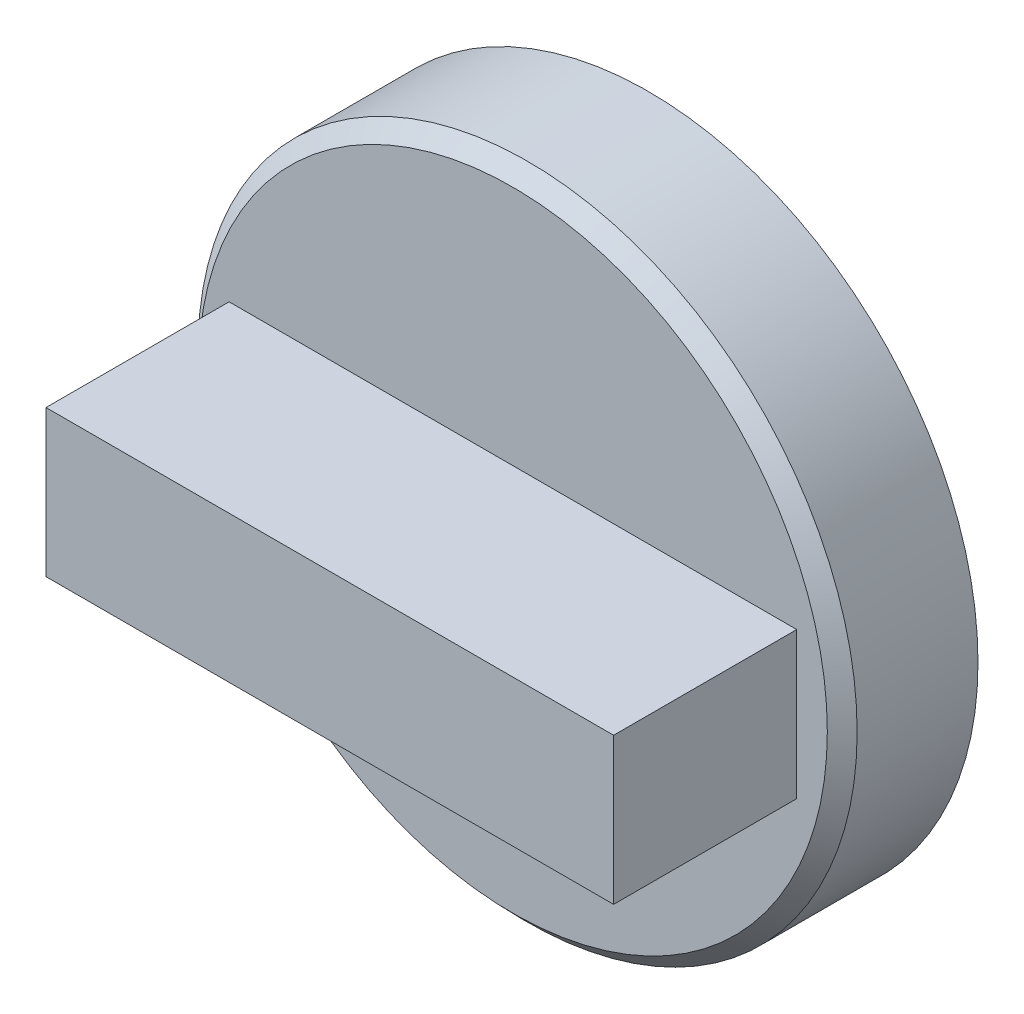
ISO-10303-21;
HEADER;
FILE_DESCRIPTION(('STEP AP214'),'2;1');
FILE_NAME('part.step','',(''),(''),'','','');
FILE_SCHEMA(('AUTOMOTIVE_DESIGN { 1 0 10303 214 1 1 1 1 }'));
ENDSEC;
DATA;
#1=APPLICATION_CONTEXT('core data for automotive mechanical design processes');
#2=APPLICATION_PROTOCOL_DEFINITION('international standard','automotive_design',2000,#1);
#3=PRODUCT_CONTEXT('',#1,'mechanical');
#4=PRODUCT('Part','Part','',(#3));
#5=PRODUCT_RELATED_PRODUCT_CATEGORY('part','',(#4));
#6=PRODUCT_DEFINITION_FORMATION('','',#4);
#7=PRODUCT_DEFINITION_CONTEXT('part definition',#1,'design');
#8=PRODUCT_DEFINITION('design','',#6,#7);
#9=PRODUCT_DEFINITION_SHAPE('','',#8);
#10=(LENGTH_UNIT() NAMED_UNIT(*) SI_UNIT(.MILLI.,.METRE.));
#11=(NAMED_UNIT(*) PLANE_ANGLE_UNIT() SI_UNIT($,.RADIAN.));
#12=(NAMED_UNIT(*) SI_UNIT($,.STERADIAN.) SOLID_ANGLE_UNIT());
#13=UNCERTAINTY_MEASURE_WITH_UNIT(LENGTH_MEASURE(1.E-05),#10,'distance_accuracy_value','');
#14=(GEOMETRIC_REPRESENTATION_CONTEXT(3) GLOBAL_UNCERTAINTY_ASSIGNED_CONTEXT((#13)) GLOBAL_UNIT_ASSIGNED_CONTEXT((#10,
#11,#12)) REPRESENTATION_CONTEXT('',''));
#15=CARTESIAN_POINT('',(0.,0.,0.));
#16=DIRECTION('',(0.,0.,1.));
#17=DIRECTION('',(1.,0.,0.));
#18=AXIS2_PLACEMENT_3D('',#15,#16,#17);
#19=CARTESIAN_POINT('',(0.,0.,37.));
#20=DIRECTION('',(0.,0.,-1.));
#21=DIRECTION('',(-1.,0.,0.));
#22=AXIS2_PLACEMENT_3D('',#19,#20,#21);
#23=CYLINDRICAL_SURFACE('',#22,90.);
#24=CARTESIAN_POINT('',(0.,0.,33.));
#25=DIRECTION('',(0.,0.,1.));
#26=DIRECTION('',(1.,0.,0.));
#27=AXIS2_PLACEMENT_3D('',#24,#25,#26);
#28=CIRCLE('',#27,90.);
#29=CARTESIAN_POINT('',(90.,0.,33.));
#30=VERTEX_POINT('',#29);
#31=EDGE_CURVE('E11',#30,#30,#28,.F.);
#32=ORIENTED_EDGE('',*,*,#31,.T.);
#33=EDGE_LOOP('',(#32));
#34=FACE_BOUND('',#33,.T.);
#35=CARTESIAN_POINT('',(0.,0.,0.));
#36=DIRECTION('',(0.,0.,1.));
#37=DIRECTION('',(1.,0.,0.));
#38=AXIS2_PLACEMENT_3D('',#35,#36,#37);
#39=CIRCLE('',#38,90.);
#40=CARTESIAN_POINT('',(90.,0.,0.));
#41=VERTEX_POINT('',#40);
#42=EDGE_CURVE('E94',#41,#41,#39,.T.);
#43=ORIENTED_EDGE('',*,*,#42,.T.);
#44=EDGE_LOOP('',(#43));
#45=FACE_BOUND('',#44,.T.);
#46=ADVANCED_FACE('F33',(#34,#45),#23,.T.);
#47=CARTESIAN_POINT('',(0.,0.,37.));
#48=DIRECTION('',(0.,0.,1.));
#49=DIRECTION('',(1.,0.,0.));
#50=AXIS2_PLACEMENT_3D('',#47,#48,#49);
#51=PLANE('',#50);
#52=DIRECTION('',(0.,1.,0.));
#53=VECTOR('',#52,1.);
#54=CARTESIAN_POINT('',(77.5,20.,37.));
#55=LINE('',#54,#53);
#56=CARTESIAN_POINT('',(77.5,-20.,37.));
#57=VERTEX_POINT('',#56);
#58=CARTESIAN_POINT('',(77.5,20.,37.));
#59=VERTEX_POINT('',#58);
#60=EDGE_CURVE('E48',#57,#59,#55,.T.);
#61=ORIENTED_EDGE('',*,*,#60,.F.);
#62=DIRECTION('',(1.,0.,0.));
#63=VECTOR('',#62,1.);
#64=CARTESIAN_POINT('',(-77.5,-20.,37.));
#65=LINE('',#64,#63);
#66=CARTESIAN_POINT('',(-77.5,-20.,37.));
#67=VERTEX_POINT('',#66);
#68=EDGE_CURVE('E52',#67,#57,#65,.T.);
#69=ORIENTED_EDGE('',*,*,#68,.F.);
#70=DIRECTION('',(0.,-1.,0.));
#71=VECTOR('',#70,1.);
#72=CARTESIAN_POINT('',(-77.5,20.,37.));
#73=LINE('',#72,#71);
#74=CARTESIAN_POINT('',(-77.5,20.,37.));
#75=VERTEX_POINT('',#74);
#76=EDGE_CURVE('E189',#75,#67,#73,.T.);
#77=ORIENTED_EDGE('',*,*,#76,.F.);
#78=DIRECTION('',(-1.,0.,0.));
#79=VECTOR('',#78,1.);
#80=CARTESIAN_POINT('',(-77.5,20.,37.));
#81=LINE('',#80,#79);
#82=EDGE_CURVE('E195',#59,#75,#81,.T.);
#83=ORIENTED_EDGE('',*,*,#82,.F.);
#84=EDGE_LOOP('',(#61,#69,#77,#83));
#85=FACE_BOUND('',#84,.T.);
#86=CARTESIAN_POINT('',(0.,0.,37.));
#87=DIRECTION('',(0.,0.,1.));
#88=DIRECTION('',(1.,0.,0.));
#89=AXIS2_PLACEMENT_3D('',#86,#87,#88);
#90=CIRCLE('',#89,85.8578787448378);
#91=CARTESIAN_POINT('',(85.8578787448378,0.,37.));
#92=VERTEX_POINT('',#91);
#93=EDGE_CURVE('E41',#92,#92,#90,.T.);
#94=ORIENTED_EDGE('',*,*,#93,.T.);
#95=EDGE_LOOP('',(#94));
#96=FACE_BOUND('',#95,.T.);
#97=ADVANCED_FACE('F104',(#85,#96),#51,.T.);
#98=CARTESIAN_POINT('',(0.,0.,0.));
#99=DIRECTION('',(0.,0.,1.));
#100=DIRECTION('',(1.,0.,0.));
#101=AXIS2_PLACEMENT_3D('',#98,#99,#100);
#102=PLANE('',#101);
#103=ORIENTED_EDGE('',*,*,#42,.F.);
#104=EDGE_LOOP('',(#103));
#105=FACE_BOUND('',#104,.T.);
#106=ADVANCED_FACE('F107',(#105),#102,.F.);
#107=CARTESIAN_POINT('',(0.,0.,37.));
#108=DIRECTION('',(0.,0.,-1.));
#109=DIRECTION('',(-1.,0.,0.));
#110=AXIS2_PLACEMENT_3D('',#107,#108,#109);
#111=CONICAL_SURFACE('',#110,85.8578787448378,0.802851455917391);
#112=ORIENTED_EDGE('',*,*,#31,.F.);
#113=EDGE_LOOP('',(#112));
#114=FACE_BOUND('',#113,.T.);
#115=ORIENTED_EDGE('',*,*,#93,.F.);
#116=EDGE_LOOP('',(#115));
#117=FACE_BOUND('',#116,.T.);
#118=ADVANCED_FACE('F35',(#114,#117),#111,.T.);
#119=CARTESIAN_POINT('',(77.5,20.,87.));
#120=DIRECTION('',(-1.,0.,0.));
#121=DIRECTION('',(0.,0.,1.));
#122=AXIS2_PLACEMENT_3D('',#119,#120,#121);
#123=PLANE('',#122);
#124=ORIENTED_EDGE('',*,*,#60,.T.);
#125=DIRECTION('',(0.,0.,-1.));
#126=VECTOR('',#125,1.);
#127=CARTESIAN_POINT('',(77.5,20.,87.));
#128=LINE('',#127,#126);
#129=CARTESIAN_POINT('',(77.5,20.,87.));
#130=VERTEX_POINT('',#129);
#131=EDGE_CURVE('E77',#130,#59,#128,.T.);
#132=ORIENTED_EDGE('',*,*,#131,.F.);
#133=DIRECTION('',(0.,1.,0.));
#134=VECTOR('',#133,1.);
#135=CARTESIAN_POINT('',(77.5,20.,87.));
#136=LINE('',#135,#134);
#137=CARTESIAN_POINT('',(77.5,-20.,87.));
#138=VERTEX_POINT('',#137);
#139=EDGE_CURVE('E83',#138,#130,#136,.T.);
#140=ORIENTED_EDGE('',*,*,#139,.F.);
#141=DIRECTION('',(0.,0.,-1.));
#142=VECTOR('',#141,1.);
#143=CARTESIAN_POINT('',(77.5,-20.,87.));
#144=LINE('',#143,#142);
#145=EDGE_CURVE('E187',#138,#57,#144,.T.);
#146=ORIENTED_EDGE('',*,*,#145,.T.);
#147=EDGE_LOOP('',(#124,#132,#140,#146));
#148=FACE_BOUND('',#147,.T.);
#149=ADVANCED_FACE('F93',(#148),#123,.F.);
#150=CARTESIAN_POINT('',(-77.5,20.,87.));
#151=DIRECTION('',(0.,-1.,0.));
#152=DIRECTION('',(0.,0.,-1.));
#153=AXIS2_PLACEMENT_3D('',#150,#151,#152);
#154=PLANE('',#153);
#155=ORIENTED_EDGE('',*,*,#82,.T.);
#156=DIRECTION('',(0.,0.,-1.));
#157=VECTOR('',#156,1.);
#158=CARTESIAN_POINT('',(-77.5,20.,87.));
#159=LINE('',#158,#157);
#160=CARTESIAN_POINT('',(-77.5,20.,87.));
#161=VERTEX_POINT('',#160);
#162=EDGE_CURVE('E79',#161,#75,#159,.T.);
#163=ORIENTED_EDGE('',*,*,#162,.F.);
#164=DIRECTION('',(-1.,0.,0.));
#165=VECTOR('',#164,1.);
#166=CARTESIAN_POINT('',(-77.5,20.,87.));
#167=LINE('',#166,#165);
#168=EDGE_CURVE('E72',#130,#161,#167,.T.);
#169=ORIENTED_EDGE('',*,*,#168,.F.);
#170=ORIENTED_EDGE('',*,*,#131,.T.);
#171=EDGE_LOOP('',(#155,#163,#169,#170));
#172=FACE_BOUND('',#171,.T.);
#173=ADVANCED_FACE('F75',(#172),#154,.F.);
#174=CARTESIAN_POINT('',(-77.5,20.,87.));
#175=DIRECTION('',(1.,0.,0.));
#176=DIRECTION('',(0.,0.,-1.));
#177=AXIS2_PLACEMENT_3D('',#174,#175,#176);
#178=PLANE('',#177);
#179=ORIENTED_EDGE('',*,*,#76,.T.);
#180=DIRECTION('',(0.,0.,-1.));
#181=VECTOR('',#180,1.);
#182=CARTESIAN_POINT('',(-77.5,-20.,87.));
#183=LINE('',#182,#181);
#184=CARTESIAN_POINT('',(-77.5,-20.,87.));
#185=VERTEX_POINT('',#184);
#186=EDGE_CURVE('E98',#185,#67,#183,.T.);
#187=ORIENTED_EDGE('',*,*,#186,.F.);
#188=DIRECTION('',(0.,-1.,0.));
#189=VECTOR('',#188,1.);
#190=CARTESIAN_POINT('',(-77.5,20.,87.));
#191=LINE('',#190,#189);
#192=EDGE_CURVE('E82',#161,#185,#191,.T.);
#193=ORIENTED_EDGE('',*,*,#192,.F.);
#194=ORIENTED_EDGE('',*,*,#162,.T.);
#195=EDGE_LOOP('',(#179,#187,#193,#194));
#196=FACE_BOUND('',#195,.T.);
#197=ADVANCED_FACE('F127',(#196),#178,.F.);
#198=CARTESIAN_POINT('',(-77.5,-20.,87.));
#199=DIRECTION('',(0.,1.,0.));
#200=DIRECTION('',(-1.,0.,0.));
#201=AXIS2_PLACEMENT_3D('',#198,#199,#200);
#202=PLANE('',#201);
#203=ORIENTED_EDGE('',*,*,#68,.T.);
#204=ORIENTED_EDGE('',*,*,#145,.F.);
#205=DIRECTION('',(1.,0.,0.));
#206=VECTOR('',#205,1.);
#207=CARTESIAN_POINT('',(-77.5,-20.,87.));
#208=LINE('',#207,#206);
#209=EDGE_CURVE('E88',#185,#138,#208,.T.);
#210=ORIENTED_EDGE('',*,*,#209,.F.);
#211=ORIENTED_EDGE('',*,*,#186,.T.);
#212=EDGE_LOOP('',(#203,#204,#210,#211));
#213=FACE_BOUND('',#212,.T.);
#214=ADVANCED_FACE('F130',(#213),#202,.F.);
#215=CARTESIAN_POINT('',(0.,0.,87.));
#216=DIRECTION('',(0.,0.,1.));
#217=DIRECTION('',(1.,0.,0.));
#218=AXIS2_PLACEMENT_3D('',#215,#216,#217);
#219=PLANE('',#218);
#220=ORIENTED_EDGE('',*,*,#139,.T.);
#221=ORIENTED_EDGE('',*,*,#168,.T.);
#222=ORIENTED_EDGE('',*,*,#192,.T.);
#223=ORIENTED_EDGE('',*,*,#209,.T.);
#224=EDGE_LOOP('',(#220,#221,#222,#223));
#225=FACE_BOUND('',#224,.T.);
#226=ADVANCED_FACE('F86',(#225),#219,.T.);
#227=CLOSED_SHELL('',(#46,#97,#106,#118,#149,#173,#197,#214,#226));
#228=MANIFOLD_SOLID_BREP('B2',#227);
#229=ADVANCED_BREP_SHAPE_REPRESENTATION('',(#18,#228),#14);
#230=SHAPE_DEFINITION_REPRESENTATION(#9,#229);
ENDSEC;
END-ISO-10303-21;
